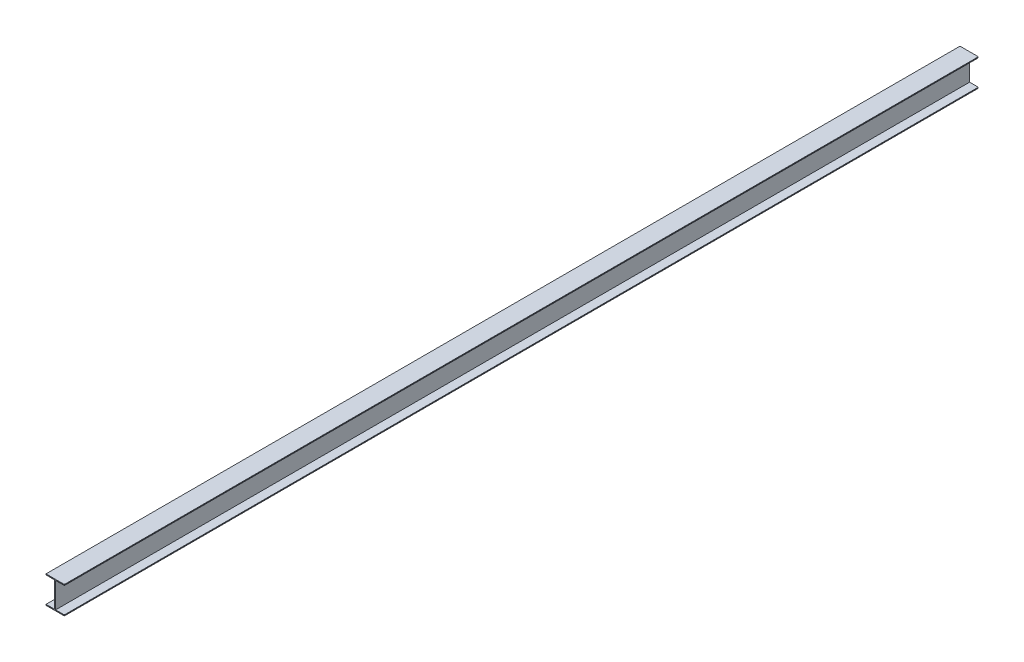
ISO-10303-21;
HEADER;
FILE_DESCRIPTION(('STEP AP214'),'2;1');
FILE_NAME('part.step','',(''),(''),'','','');
FILE_SCHEMA(('AUTOMOTIVE_DESIGN { 1 0 10303 214 1 1 1 1 }'));
ENDSEC;
DATA;
#1=APPLICATION_CONTEXT('core data for automotive mechanical design processes');
#2=APPLICATION_PROTOCOL_DEFINITION('international standard','automotive_design',2000,#1);
#3=PRODUCT_CONTEXT('',#1,'mechanical');
#4=PRODUCT('Part','Part','',(#3));
#5=PRODUCT_RELATED_PRODUCT_CATEGORY('part','',(#4));
#6=PRODUCT_DEFINITION_FORMATION('','',#4);
#7=PRODUCT_DEFINITION_CONTEXT('part definition',#1,'design');
#8=PRODUCT_DEFINITION('design','',#6,#7);
#9=PRODUCT_DEFINITION_SHAPE('','',#8);
#10=(LENGTH_UNIT() NAMED_UNIT(*) SI_UNIT(.MILLI.,.METRE.));
#11=(NAMED_UNIT(*) PLANE_ANGLE_UNIT() SI_UNIT($,.RADIAN.));
#12=(NAMED_UNIT(*) SI_UNIT($,.STERADIAN.) SOLID_ANGLE_UNIT());
#13=UNCERTAINTY_MEASURE_WITH_UNIT(LENGTH_MEASURE(1.E-05),#10,'distance_accuracy_value','');
#14=(GEOMETRIC_REPRESENTATION_CONTEXT(3) GLOBAL_UNCERTAINTY_ASSIGNED_CONTEXT((#13)) GLOBAL_UNIT_ASSIGNED_CONTEXT((#10,
#11,#12)) REPRESENTATION_CONTEXT('',''));
#15=CARTESIAN_POINT('',(0.,0.,0.));
#16=DIRECTION('',(0.,0.,1.));
#17=DIRECTION('',(1.,0.,0.));
#18=AXIS2_PLACEMENT_3D('',#15,#16,#17);
#19=CARTESIAN_POINT('',(101.6,-153.162240532958,5062.));
#20=DIRECTION('',(0.,1.,0.));
#21=DIRECTION('',(0.,0.,1.));
#22=AXIS2_PLACEMENT_3D('',#19,#20,#21);
#23=PLANE('',#22);
#24=DIRECTION('',(-1.,0.,0.));
#25=VECTOR('',#24,1.);
#26=CARTESIAN_POINT('',(101.6,-153.162240532958,2683.4));
#27=LINE('',#26,#25);
#28=CARTESIAN_POINT('',(98.425,-153.162240532958,2683.4));
#29=VERTEX_POINT('',#28);
#30=CARTESIAN_POINT('',(3.175,-153.162240532958,2683.4));
#31=VERTEX_POINT('',#30);
#32=EDGE_CURVE('E289',#29,#31,#27,.T.);
#33=ORIENTED_EDGE('',*,*,#32,.F.);
#34=DIRECTION('',(0.,0.,-1.));
#35=VECTOR('',#34,1.);
#36=CARTESIAN_POINT('',(98.425,-153.162240532958,5062.));
#37=LINE('',#36,#35);
#38=CARTESIAN_POINT('',(98.425,-153.162240532958,5058.825));
#39=VERTEX_POINT('',#38);
#40=EDGE_CURVE('E357',#29,#39,#37,.F.);
#41=ORIENTED_EDGE('',*,*,#40,.T.);
#42=DIRECTION('',(1.,0.,0.));
#43=VECTOR('',#42,1.);
#44=CARTESIAN_POINT('',(101.6,-153.162240532958,5058.825));
#45=LINE('',#44,#43);
#46=CARTESIAN_POINT('',(3.175,-153.162240532958,5058.825));
#47=VERTEX_POINT('',#46);
#48=EDGE_CURVE('E353',#39,#47,#45,.F.);
#49=ORIENTED_EDGE('',*,*,#48,.T.);
#50=DIRECTION('',(0.,0.,-1.));
#51=VECTOR('',#50,1.);
#52=CARTESIAN_POINT('',(3.175,-153.162240532958,5062.));
#53=LINE('',#52,#51);
#54=EDGE_CURVE('E355',#47,#31,#53,.T.);
#55=ORIENTED_EDGE('',*,*,#54,.T.);
#56=EDGE_LOOP('',(#33,#41,#49,#55));
#57=FACE_BOUND('',#56,.T.);
#58=ADVANCED_FACE('F40',(#57),#23,.F.);
#59=DIRECTION('',(1.,0.,0.));
#60=VECTOR('',#59,1.);
#61=CARTESIAN_POINT('',(101.6,-153.162240532958,2378.6));
#62=LINE('',#61,#60);
#63=CARTESIAN_POINT('',(3.175,-153.162240532958,2378.6));
#64=VERTEX_POINT('',#63);
#65=CARTESIAN_POINT('',(98.425,-153.162240532958,2378.6));
#66=VERTEX_POINT('',#65);
#67=EDGE_CURVE('E285',#64,#66,#62,.T.);
#68=ORIENTED_EDGE('',*,*,#67,.F.);
#69=DIRECTION('',(0.,0.,-1.));
#70=VECTOR('',#69,1.);
#71=CARTESIAN_POINT('',(3.175,-153.162240532958,5062.));
#72=LINE('',#71,#70);
#73=CARTESIAN_POINT('',(3.175,-153.162240532958,3.17499999999971));
#74=VERTEX_POINT('',#73);
#75=EDGE_CURVE('E325',#64,#74,#72,.T.);
#76=ORIENTED_EDGE('',*,*,#75,.T.);
#77=DIRECTION('',(1.,0.,0.));
#78=VECTOR('',#77,1.);
#79=CARTESIAN_POINT('',(98.425,-153.162240532958,3.17499999999971));
#80=LINE('',#79,#78);
#81=CARTESIAN_POINT('',(98.425,-153.162240532958,3.17499999999971));
#82=VERTEX_POINT('',#81);
#83=EDGE_CURVE('E323',#74,#82,#80,.T.);
#84=ORIENTED_EDGE('',*,*,#83,.T.);
#85=DIRECTION('',(0.,0.,-1.));
#86=VECTOR('',#85,1.);
#87=CARTESIAN_POINT('',(98.425,-153.162240532958,5062.));
#88=LINE('',#87,#86);
#89=EDGE_CURVE('E321',#82,#66,#88,.F.);
#90=ORIENTED_EDGE('',*,*,#89,.T.);
#91=EDGE_LOOP('',(#68,#76,#84,#90));
#92=FACE_BOUND('',#91,.T.);
#93=ADVANCED_FACE('F573',(#92),#23,.F.);
#94=CARTESIAN_POINT('',(0.,-7.11224053295814,5062.));
#95=DIRECTION('',(1.,0.,0.));
#96=DIRECTION('',(0.,0.,-1.));
#97=AXIS2_PLACEMENT_3D('',#94,#95,#96);
#98=PLANE('',#97);
#99=DIRECTION('',(0.,-1.,0.));
#100=VECTOR('',#99,1.);
#101=CARTESIAN_POINT('',(0.,-7.11224053295814,0.));
#102=LINE('',#101,#100);
#103=CARTESIAN_POINT('',(0.,-0.000240532958142959,0.));
#104=VERTEX_POINT('',#103);
#105=CARTESIAN_POINT('',(0.,-3.93724053295814,0.));
#106=VERTEX_POINT('',#105);
#107=EDGE_CURVE('E252',#104,#106,#102,.T.);
#108=ORIENTED_EDGE('',*,*,#107,.T.);
#109=DIRECTION('',(0.,0.,-1.));
#110=VECTOR('',#109,1.);
#111=CARTESIAN_POINT('',(0.,-3.93724053295814,5062.));
#112=LINE('',#111,#110);
#113=CARTESIAN_POINT('',(0.,-3.93724053295814,5062.));
#114=VERTEX_POINT('',#113);
#115=EDGE_CURVE('E419',#106,#114,#112,.F.);
#116=ORIENTED_EDGE('',*,*,#115,.T.);
#117=DIRECTION('',(0.,-1.,0.));
#118=VECTOR('',#117,1.);
#119=CARTESIAN_POINT('',(0.,-7.11224053295814,5062.));
#120=LINE('',#119,#118);
#121=CARTESIAN_POINT('',(0.,-0.000240532958142959,5062.));
#122=VERTEX_POINT('',#121);
#123=EDGE_CURVE('E226',#122,#114,#120,.T.);
#124=ORIENTED_EDGE('',*,*,#123,.F.);
#125=DIRECTION('',(0.,0.,-1.));
#126=VECTOR('',#125,1.);
#127=CARTESIAN_POINT('',(0.,-0.000240532958142959,5062.));
#128=LINE('',#127,#126);
#129=EDGE_CURVE('E251',#122,#104,#128,.T.);
#130=ORIENTED_EDGE('',*,*,#129,.T.);
#131=EDGE_LOOP('',(#108,#116,#124,#130));
#132=FACE_BOUND('',#131,.T.);
#133=ADVANCED_FACE('F461',(#132),#98,.F.);
#134=CARTESIAN_POINT('',(47.5660357142857,-7.11224053295814,5062.));
#135=DIRECTION('',(0.,1.,0.));
#136=DIRECTION('',(-1.,0.,0.));
#137=AXIS2_PLACEMENT_3D('',#134,#135,#136);
#138=PLANE('',#137);
#139=DIRECTION('',(0.,0.,-1.));
#140=VECTOR('',#139,1.);
#141=CARTESIAN_POINT('',(3.17499999999997,-7.11224053295814,5062.));
#142=LINE('',#141,#140);
#143=CARTESIAN_POINT('',(3.17499999999997,-7.11224053295814,5058.825));
#144=VERTEX_POINT('',#143);
#145=CARTESIAN_POINT('',(3.17499999999997,-7.11224053295814,3.17499999999971));
#146=VERTEX_POINT('',#145);
#147=EDGE_CURVE('E414',#144,#146,#142,.T.);
#148=ORIENTED_EDGE('',*,*,#147,.T.);
#149=DIRECTION('',(1.,0.,0.));
#150=VECTOR('',#149,1.);
#151=CARTESIAN_POINT('',(47.5660357142857,-7.11224053295814,3.17499999999971));
#152=LINE('',#151,#150);
#153=CARTESIAN_POINT('',(47.5660357142857,-7.11224053295814,3.17499999999971));
#154=VERTEX_POINT('',#153);
#155=EDGE_CURVE('E416',#146,#154,#152,.T.);
#156=ORIENTED_EDGE('',*,*,#155,.T.);
#157=DIRECTION('',(0.,0.,-1.));
#158=VECTOR('',#157,1.);
#159=CARTESIAN_POINT('',(47.5660357142857,-7.11224053295814,5062.));
#160=LINE('',#159,#158);
#161=CARTESIAN_POINT('',(47.5660357142857,-7.11224053295814,5058.825));
#162=VERTEX_POINT('',#161);
#163=EDGE_CURVE('E235',#162,#154,#160,.T.);
#164=ORIENTED_EDGE('',*,*,#163,.F.);
#165=DIRECTION('',(1.,0.,0.));
#166=VECTOR('',#165,1.);
#167=CARTESIAN_POINT('',(47.5660357142857,-7.11224053295814,5058.825));
#168=LINE('',#167,#166);
#169=EDGE_CURVE('E412',#162,#144,#168,.F.);
#170=ORIENTED_EDGE('',*,*,#169,.T.);
#171=EDGE_LOOP('',(#148,#156,#164,#170));
#172=FACE_BOUND('',#171,.T.);
#173=ADVANCED_FACE('F454',(#172),#138,.F.);
#174=CARTESIAN_POINT('',(47.5660357142857,-146.050240532958,5062.));
#175=DIRECTION('',(1.,0.,0.));
#176=DIRECTION('',(0.,0.,-1.));
#177=AXIS2_PLACEMENT_3D('',#174,#175,#176);
#178=PLANE('',#177);
#179=DIRECTION('',(0.,-1.,0.));
#180=VECTOR('',#179,1.);
#181=CARTESIAN_POINT('',(47.5660357142857,-146.050240532958,0.));
#182=LINE('',#181,#180);
#183=CARTESIAN_POINT('',(47.5660357142857,-3.93724053295814,0.));
#184=VERTEX_POINT('',#183);
#185=CARTESIAN_POINT('',(47.5660357142857,-146.050240532958,0.));
#186=VERTEX_POINT('',#185);
#187=EDGE_CURVE('E232',#184,#186,#182,.T.);
#188=ORIENTED_EDGE('',*,*,#187,.T.);
#189=DIRECTION('',(0.,0.,-1.));
#190=VECTOR('',#189,1.);
#191=CARTESIAN_POINT('',(47.5660357142857,-146.050240532958,5062.));
#192=LINE('',#191,#190);
#193=CARTESIAN_POINT('',(47.5660357142857,-146.050240532958,5062.));
#194=VERTEX_POINT('',#193);
#195=EDGE_CURVE('E229',#194,#186,#192,.T.);
#196=ORIENTED_EDGE('',*,*,#195,.F.);
#197=DIRECTION('',(0.,-1.,0.));
#198=VECTOR('',#197,1.);
#199=CARTESIAN_POINT('',(47.5660357142857,-146.050240532958,5062.));
#200=LINE('',#199,#198);
#201=CARTESIAN_POINT('',(47.5660357142857,-3.93724053295813,5062.));
#202=VERTEX_POINT('',#201);
#203=EDGE_CURVE('E64',#202,#194,#200,.T.);
#204=ORIENTED_EDGE('',*,*,#203,.F.);
#205=CARTESIAN_POINT('',(47.5660357142857,-3.93724053295814,5058.825));
#206=DIRECTION('',(1.,0.,0.));
#207=DIRECTION('',(0.,0.,-1.));
#208=AXIS2_PLACEMENT_3D('',#205,#206,#207);
#209=CIRCLE('',#208,3.175);
#210=EDGE_CURVE('E11',#202,#162,#209,.T.);
#211=ORIENTED_EDGE('',*,*,#210,.T.);
#212=ORIENTED_EDGE('',*,*,#163,.T.);
#213=CARTESIAN_POINT('',(47.5660357142857,-3.93724053295814,3.17499999999971));
#214=DIRECTION('',(1.,0.,0.));
#215=DIRECTION('',(0.,0.,-1.));
#216=AXIS2_PLACEMENT_3D('',#213,#214,#215);
#217=CIRCLE('',#216,3.175);
#218=EDGE_CURVE('E426',#154,#184,#217,.T.);
#219=ORIENTED_EDGE('',*,*,#218,.T.);
#220=EDGE_LOOP('',(#188,#196,#204,#211,#212,#219));
#221=FACE_BOUND('',#220,.T.);
#222=ADVANCED_FACE('F230',(#221),#178,.F.);
#223=CARTESIAN_POINT('',(0.,-146.050240532958,5062.));
#224=DIRECTION('',(0.,-1.,0.));
#225=DIRECTION('',(1.,0.,0.));
#226=AXIS2_PLACEMENT_3D('',#223,#224,#225);
#227=PLANE('',#226);
#228=DIRECTION('',(-1.,0.,0.));
#229=VECTOR('',#228,1.);
#230=CARTESIAN_POINT('',(0.,-146.050240532958,0.));
#231=LINE('',#230,#229);
#232=CARTESIAN_POINT('',(0.,-146.050240532958,0.));
#233=VERTEX_POINT('',#232);
#234=EDGE_CURVE('E257',#186,#233,#231,.T.);
#235=ORIENTED_EDGE('',*,*,#234,.T.);
#236=DIRECTION('',(0.,0.,-1.));
#237=VECTOR('',#236,1.);
#238=CARTESIAN_POINT('',(0.,-146.050240532958,5062.));
#239=LINE('',#238,#237);
#240=CARTESIAN_POINT('',(0.,-146.050240532958,5062.));
#241=VERTEX_POINT('',#240);
#242=EDGE_CURVE('E236',#241,#233,#239,.T.);
#243=ORIENTED_EDGE('',*,*,#242,.F.);
#244=DIRECTION('',(-1.,0.,0.));
#245=VECTOR('',#244,1.);
#246=CARTESIAN_POINT('',(0.,-146.050240532958,5062.));
#247=LINE('',#246,#245);
#248=EDGE_CURVE('E220',#194,#241,#247,.T.);
#249=ORIENTED_EDGE('',*,*,#248,.F.);
#250=ORIENTED_EDGE('',*,*,#195,.T.);
#251=EDGE_LOOP('',(#235,#243,#249,#250));
#252=FACE_BOUND('',#251,.T.);
#253=ADVANCED_FACE('F238',(#252),#227,.F.);
#254=CARTESIAN_POINT('',(0.,-153.162240532958,5062.));
#255=DIRECTION('',(1.,0.,0.));
#256=DIRECTION('',(0.,0.,-1.));
#257=AXIS2_PLACEMENT_3D('',#254,#255,#256);
#258=PLANE('',#257);
#259=DIRECTION('',(0.,-1.,0.));
#260=VECTOR('',#259,1.);
#261=CARTESIAN_POINT('',(0.,-153.162240532958,0.));
#262=LINE('',#261,#260);
#263=CARTESIAN_POINT('',(0.,-149.987240532958,0.));
#264=VERTEX_POINT('',#263);
#265=EDGE_CURVE('E259',#233,#264,#262,.T.);
#266=ORIENTED_EDGE('',*,*,#265,.T.);
#267=DIRECTION('',(0.,0.,-1.));
#268=VECTOR('',#267,1.);
#269=CARTESIAN_POINT('',(0.,-149.987240532958,5062.));
#270=LINE('',#269,#268);
#271=CARTESIAN_POINT('',(0.,-149.987240532958,2378.6));
#272=VERTEX_POINT('',#271);
#273=EDGE_CURVE('E332',#264,#272,#270,.F.);
#274=ORIENTED_EDGE('',*,*,#273,.T.);
#275=DIRECTION('',(0.,0.,-1.));
#276=VECTOR('',#275,1.);
#277=CARTESIAN_POINT('',(0.,-149.987240532958,5062.));
#278=LINE('',#277,#276);
#279=CARTESIAN_POINT('',(0.,-149.987240532958,2683.4));
#280=VERTEX_POINT('',#279);
#281=EDGE_CURVE('E330',#272,#280,#278,.F.);
#282=ORIENTED_EDGE('',*,*,#281,.T.);
#283=DIRECTION('',(0.,0.,-1.));
#284=VECTOR('',#283,1.);
#285=CARTESIAN_POINT('',(0.,-149.987240532958,5062.));
#286=LINE('',#285,#284);
#287=CARTESIAN_POINT('',(0.,-149.987240532958,5062.));
#288=VERTEX_POINT('',#287);
#289=EDGE_CURVE('E328',#280,#288,#286,.F.);
#290=ORIENTED_EDGE('',*,*,#289,.T.);
#291=DIRECTION('',(0.,-1.,0.));
#292=VECTOR('',#291,1.);
#293=CARTESIAN_POINT('',(0.,-153.162240532958,5062.));
#294=LINE('',#293,#292);
#295=EDGE_CURVE('E241',#241,#288,#294,.T.);
#296=ORIENTED_EDGE('',*,*,#295,.F.);
#297=ORIENTED_EDGE('',*,*,#242,.T.);
#298=EDGE_LOOP('',(#266,#274,#282,#290,#296,#297));
#299=FACE_BOUND('',#298,.T.);
#300=ADVANCED_FACE('F516',(#299),#258,.F.);
#301=ORIENTED_EDGE('',*,*,#32,.T.);
#302=DIRECTION('',(0.,0.,-1.));
#303=VECTOR('',#302,1.);
#304=CARTESIAN_POINT('',(3.175,-153.162240532958,5062.));
#305=LINE('',#304,#303);
#306=EDGE_CURVE('E339',#31,#64,#305,.T.);
#307=ORIENTED_EDGE('',*,*,#306,.T.);
#308=ORIENTED_EDGE('',*,*,#67,.T.);
#309=DIRECTION('',(0.,0.,-1.));
#310=VECTOR('',#309,1.);
#311=CARTESIAN_POINT('',(98.425,-153.162240532958,5062.));
#312=LINE('',#311,#310);
#313=CARTESIAN_POINT('',(98.425,-153.162240532958,2531.));
#314=VERTEX_POINT('',#313);
#315=EDGE_CURVE('E337',#66,#314,#312,.F.);
#316=ORIENTED_EDGE('',*,*,#315,.T.);
#317=DIRECTION('',(0.,0.,-1.));
#318=VECTOR('',#317,1.);
#319=CARTESIAN_POINT('',(98.425,-153.162240532958,5062.));
#320=LINE('',#319,#318);
#321=EDGE_CURVE('E335',#314,#29,#320,.F.);
#322=ORIENTED_EDGE('',*,*,#321,.T.);
#323=EDGE_LOOP('',(#301,#307,#308,#316,#322));
#324=FACE_BOUND('',#323,.T.);
#325=ADVANCED_FACE('F534',(#324),#23,.F.);
#326=CARTESIAN_POINT('',(101.6,-146.050240532958,5062.));
#327=DIRECTION('',(-1.,0.,0.));
#328=DIRECTION('',(0.,0.,1.));
#329=AXIS2_PLACEMENT_3D('',#326,#327,#328);
#330=PLANE('',#329);
#331=DIRECTION('',(0.,0.,-1.));
#332=VECTOR('',#331,1.);
#333=CARTESIAN_POINT('',(101.6,-149.987240532958,5062.));
#334=LINE('',#333,#332);
#335=CARTESIAN_POINT('',(101.6,-149.987240532958,2531.));
#336=VERTEX_POINT('',#335);
#337=CARTESIAN_POINT('',(101.6,-149.987240532958,2378.6));
#338=VERTEX_POINT('',#337);
#339=EDGE_CURVE('E349',#336,#338,#334,.T.);
#340=ORIENTED_EDGE('',*,*,#339,.T.);
#341=DIRECTION('',(0.,0.,-1.));
#342=VECTOR('',#341,1.);
#343=CARTESIAN_POINT('',(101.6,-149.987240532958,5062.));
#344=LINE('',#343,#342);
#345=CARTESIAN_POINT('',(101.6,-149.987240532958,3.17499999999971));
#346=VERTEX_POINT('',#345);
#347=EDGE_CURVE('E351',#338,#346,#344,.T.);
#348=ORIENTED_EDGE('',*,*,#347,.T.);
#349=DIRECTION('',(0.,1.,0.));
#350=VECTOR('',#349,1.);
#351=CARTESIAN_POINT('',(101.6,-146.050240532958,3.17499999999971));
#352=LINE('',#351,#350);
#353=CARTESIAN_POINT('',(101.6,-146.050240532958,3.17499999999971));
#354=VERTEX_POINT('',#353);
#355=EDGE_CURVE('E310',#346,#354,#352,.T.);
#356=ORIENTED_EDGE('',*,*,#355,.T.);
#357=DIRECTION('',(0.,0.,-1.));
#358=VECTOR('',#357,1.);
#359=CARTESIAN_POINT('',(101.6,-146.050240532958,5062.));
#360=LINE('',#359,#358);
#361=CARTESIAN_POINT('',(101.6,-146.050240532958,5058.825));
#362=VERTEX_POINT('',#361);
#363=EDGE_CURVE('E279',#362,#354,#360,.T.);
#364=ORIENTED_EDGE('',*,*,#363,.F.);
#365=DIRECTION('',(0.,1.,0.));
#366=VECTOR('',#365,1.);
#367=CARTESIAN_POINT('',(101.6,-146.050240532958,5058.825));
#368=LINE('',#367,#366);
#369=CARTESIAN_POINT('',(101.6,-149.987240532958,5058.825));
#370=VERTEX_POINT('',#369);
#371=EDGE_CURVE('E312',#362,#370,#368,.F.);
#372=ORIENTED_EDGE('',*,*,#371,.T.);
#373=DIRECTION('',(0.,0.,-1.));
#374=VECTOR('',#373,1.);
#375=CARTESIAN_POINT('',(101.6,-149.987240532958,5062.));
#376=LINE('',#375,#374);
#377=CARTESIAN_POINT('',(101.6,-149.987240532958,2683.4));
#378=VERTEX_POINT('',#377);
#379=EDGE_CURVE('E345',#370,#378,#376,.T.);
#380=ORIENTED_EDGE('',*,*,#379,.T.);
#381=DIRECTION('',(0.,0.,-1.));
#382=VECTOR('',#381,1.);
#383=CARTESIAN_POINT('',(101.6,-149.987240532958,5062.));
#384=LINE('',#383,#382);
#385=EDGE_CURVE('E347',#378,#336,#384,.T.);
#386=ORIENTED_EDGE('',*,*,#385,.T.);
#387=EDGE_LOOP('',(#340,#348,#356,#364,#372,#380,#386));
#388=FACE_BOUND('',#387,.T.);
#389=ADVANCED_FACE('F549',(#388),#330,.F.);
#390=CARTESIAN_POINT('',(53.4080357142857,-146.050240532958,5062.));
#391=DIRECTION('',(0.,-1.,0.));
#392=DIRECTION('',(1.,0.,0.));
#393=AXIS2_PLACEMENT_3D('',#390,#391,#392);
#394=PLANE('',#393);
#395=DIRECTION('',(-1.,0.,0.));
#396=VECTOR('',#395,1.);
#397=CARTESIAN_POINT('',(53.4080357142857,-146.050240532958,5062.));
#398=LINE('',#397,#396);
#399=CARTESIAN_POINT('',(98.425,-146.050240532958,5062.));
#400=VERTEX_POINT('',#399);
#401=CARTESIAN_POINT('',(53.4080357142857,-146.050240532958,5062.));
#402=VERTEX_POINT('',#401);
#403=EDGE_CURVE('E243',#400,#402,#398,.T.);
#404=ORIENTED_EDGE('',*,*,#403,.F.);
#405=CARTESIAN_POINT('',(98.425,-146.050240532958,5058.825));
#406=DIRECTION('',(0.,-1.,0.));
#407=DIRECTION('',(1.,0.,0.));
#408=AXIS2_PLACEMENT_3D('',#405,#406,#407);
#409=CIRCLE('',#408,3.175);
#410=EDGE_CURVE('E308',#400,#362,#409,.F.);
#411=ORIENTED_EDGE('',*,*,#410,.T.);
#412=ORIENTED_EDGE('',*,*,#363,.T.);
#413=CARTESIAN_POINT('',(98.425,-146.050240532958,3.17499999999971));
#414=DIRECTION('',(0.,-1.,0.));
#415=DIRECTION('',(1.,0.,0.));
#416=AXIS2_PLACEMENT_3D('',#413,#414,#415);
#417=CIRCLE('',#416,3.175);
#418=CARTESIAN_POINT('',(98.425,-146.050240532958,0.));
#419=VERTEX_POINT('',#418);
#420=EDGE_CURVE('E306',#354,#419,#417,.F.);
#421=ORIENTED_EDGE('',*,*,#420,.T.);
#422=DIRECTION('',(-1.,0.,0.));
#423=VECTOR('',#422,1.);
#424=CARTESIAN_POINT('',(53.4080357142857,-146.050240532958,0.));
#425=LINE('',#424,#423);
#426=CARTESIAN_POINT('',(53.4080357142857,-146.050240532958,0.));
#427=VERTEX_POINT('',#426);
#428=EDGE_CURVE('E262',#419,#427,#425,.T.);
#429=ORIENTED_EDGE('',*,*,#428,.T.);
#430=DIRECTION('',(0.,0.,-1.));
#431=VECTOR('',#430,1.);
#432=CARTESIAN_POINT('',(53.4080357142857,-146.050240532958,5062.));
#433=LINE('',#432,#431);
#434=EDGE_CURVE('E276',#402,#427,#433,.T.);
#435=ORIENTED_EDGE('',*,*,#434,.F.);
#436=EDGE_LOOP('',(#404,#411,#412,#421,#429,#435));
#437=FACE_BOUND('',#436,.T.);
#438=ADVANCED_FACE('F492',(#437),#394,.F.);
#439=CARTESIAN_POINT('',(53.4080357142857,-7.11224053295815,5062.));
#440=DIRECTION('',(-1.,0.,0.));
#441=DIRECTION('',(0.,-1.,0.));
#442=AXIS2_PLACEMENT_3D('',#439,#440,#441);
#443=PLANE('',#442);
#444=DIRECTION('',(0.,1.,0.));
#445=VECTOR('',#444,1.);
#446=CARTESIAN_POINT('',(53.4080357142857,-7.11224053295815,0.));
#447=LINE('',#446,#445);
#448=CARTESIAN_POINT('',(53.4080357142857,-3.93724053295815,0.));
#449=VERTEX_POINT('',#448);
#450=EDGE_CURVE('E264',#427,#449,#447,.T.);
#451=ORIENTED_EDGE('',*,*,#450,.T.);
#452=CARTESIAN_POINT('',(53.4080357142857,-3.93724053295815,3.17499999999971));
#453=DIRECTION('',(-1.,0.,0.));
#454=DIRECTION('',(0.,-1.,0.));
#455=AXIS2_PLACEMENT_3D('',#452,#453,#454);
#456=CIRCLE('',#455,3.175);
#457=CARTESIAN_POINT('',(53.4080357142857,-7.11224053295815,3.17499999999971));
#458=VERTEX_POINT('',#457);
#459=EDGE_CURVE('E424',#449,#458,#456,.T.);
#460=ORIENTED_EDGE('',*,*,#459,.T.);
#461=DIRECTION('',(0.,0.,-1.));
#462=VECTOR('',#461,1.);
#463=CARTESIAN_POINT('',(53.4080357142857,-7.11224053295815,5062.));
#464=LINE('',#463,#462);
#465=CARTESIAN_POINT('',(53.4080357142857,-7.11224053295815,5058.825));
#466=VERTEX_POINT('',#465);
#467=EDGE_CURVE('E273',#466,#458,#464,.T.);
#468=ORIENTED_EDGE('',*,*,#467,.F.);
#469=CARTESIAN_POINT('',(53.4080357142857,-3.93724053295815,5058.825));
#470=DIRECTION('',(-1.,0.,0.));
#471=DIRECTION('',(0.,-1.,0.));
#472=AXIS2_PLACEMENT_3D('',#469,#470,#471);
#473=CIRCLE('',#472,3.175);
#474=CARTESIAN_POINT('',(53.4080357142857,-3.93724053295815,5062.));
#475=VERTEX_POINT('',#474);
#476=EDGE_CURVE('E49',#466,#475,#473,.T.);
#477=ORIENTED_EDGE('',*,*,#476,.T.);
#478=DIRECTION('',(0.,1.,0.));
#479=VECTOR('',#478,1.);
#480=CARTESIAN_POINT('',(53.4080357142857,-7.11224053295815,5062.));
#481=LINE('',#480,#479);
#482=EDGE_CURVE('E57',#402,#475,#481,.T.);
#483=ORIENTED_EDGE('',*,*,#482,.F.);
#484=ORIENTED_EDGE('',*,*,#434,.T.);
#485=EDGE_LOOP('',(#451,#460,#468,#477,#483,#484));
#486=FACE_BOUND('',#485,.T.);
#487=ADVANCED_FACE('F487',(#486),#443,.F.);
#488=CARTESIAN_POINT('',(101.6,-7.11224053295814,5062.));
#489=DIRECTION('',(0.,1.,0.));
#490=DIRECTION('',(-1.,0.,0.));
#491=AXIS2_PLACEMENT_3D('',#488,#489,#490);
#492=PLANE('',#491);
#493=ORIENTED_EDGE('',*,*,#467,.T.);
#494=DIRECTION('',(1.,0.,0.));
#495=VECTOR('',#494,1.);
#496=CARTESIAN_POINT('',(98.425,-7.11224053295814,3.17499999999971));
#497=LINE('',#496,#495);
#498=CARTESIAN_POINT('',(98.425,-7.11224053295814,3.17499999999971));
#499=VERTEX_POINT('',#498);
#500=EDGE_CURVE('E398',#458,#499,#497,.T.);
#501=ORIENTED_EDGE('',*,*,#500,.T.);
#502=DIRECTION('',(0.,0.,-1.));
#503=VECTOR('',#502,1.);
#504=CARTESIAN_POINT('',(98.425,-7.11224053295814,5062.));
#505=LINE('',#504,#503);
#506=CARTESIAN_POINT('',(98.425,-7.11224053295814,5058.825));
#507=VERTEX_POINT('',#506);
#508=EDGE_CURVE('E396',#499,#507,#505,.F.);
#509=ORIENTED_EDGE('',*,*,#508,.T.);
#510=DIRECTION('',(1.,0.,0.));
#511=VECTOR('',#510,1.);
#512=CARTESIAN_POINT('',(101.6,-7.11224053295814,5058.825));
#513=LINE('',#512,#511);
#514=EDGE_CURVE('E363',#507,#466,#513,.F.);
#515=ORIENTED_EDGE('',*,*,#514,.T.);
#516=EDGE_LOOP('',(#493,#501,#509,#515));
#517=FACE_BOUND('',#516,.T.);
#518=ADVANCED_FACE('F618',(#517),#492,.F.);
#519=CARTESIAN_POINT('',(101.6,-0.000240532958130516,5062.));
#520=DIRECTION('',(-1.,0.,0.));
#521=DIRECTION('',(0.,0.,1.));
#522=AXIS2_PLACEMENT_3D('',#519,#520,#521);
#523=PLANE('',#522);
#524=DIRECTION('',(0.,1.,0.));
#525=VECTOR('',#524,1.);
#526=CARTESIAN_POINT('',(101.6,-0.000240532958130516,5058.825));
#527=LINE('',#526,#525);
#528=CARTESIAN_POINT('',(101.6,-0.000240532958130516,5058.825));
#529=VERTEX_POINT('',#528);
#530=CARTESIAN_POINT('',(101.6,-3.93724053295814,5058.825));
#531=VERTEX_POINT('',#530);
#532=EDGE_CURVE('E303',#529,#531,#527,.F.);
#533=ORIENTED_EDGE('',*,*,#532,.T.);
#534=DIRECTION('',(0.,0.,-1.));
#535=VECTOR('',#534,1.);
#536=CARTESIAN_POINT('',(101.6,-3.93724053295814,5062.));
#537=LINE('',#536,#535);
#538=CARTESIAN_POINT('',(101.6,-3.93724053295814,3.17499999999971));
#539=VERTEX_POINT('',#538);
#540=EDGE_CURVE('E408',#531,#539,#537,.T.);
#541=ORIENTED_EDGE('',*,*,#540,.T.);
#542=DIRECTION('',(0.,1.,0.));
#543=VECTOR('',#542,1.);
#544=CARTESIAN_POINT('',(101.6,-0.000240532958130516,3.17499999999971));
#545=LINE('',#544,#543);
#546=CARTESIAN_POINT('',(101.6,-0.000240532958130516,3.17499999999971));
#547=VERTEX_POINT('',#546);
#548=EDGE_CURVE('E301',#539,#547,#545,.T.);
#549=ORIENTED_EDGE('',*,*,#548,.T.);
#550=DIRECTION('',(0.,0.,-1.));
#551=VECTOR('',#550,1.);
#552=CARTESIAN_POINT('',(101.6,-0.000240532958130516,5062.));
#553=LINE('',#552,#551);
#554=EDGE_CURVE('E270',#529,#547,#553,.T.);
#555=ORIENTED_EDGE('',*,*,#554,.F.);
#556=EDGE_LOOP('',(#533,#541,#549,#555));
#557=FACE_BOUND('',#556,.T.);
#558=ADVANCED_FACE('F626',(#557),#523,.F.);
#559=CARTESIAN_POINT('',(0.,-0.000240532958142959,5062.));
#560=DIRECTION('',(0.,-1.,0.));
#561=DIRECTION('',(1.,0.,0.));
#562=AXIS2_PLACEMENT_3D('',#559,#560,#561);
#563=PLANE('',#562);
#564=DIRECTION('',(-1.,0.,0.));
#565=VECTOR('',#564,1.);
#566=CARTESIAN_POINT('',(0.,-0.000240532958142959,5062.));
#567=LINE('',#566,#565);
#568=CARTESIAN_POINT('',(98.425,-0.000240532958130905,5062.));
#569=VERTEX_POINT('',#568);
#570=EDGE_CURVE('E249',#569,#122,#567,.T.);
#571=ORIENTED_EDGE('',*,*,#570,.F.);
#572=CARTESIAN_POINT('',(98.425,-0.000240532958130905,5058.825));
#573=DIRECTION('',(0.,-1.,0.));
#574=DIRECTION('',(1.,0.,0.));
#575=AXIS2_PLACEMENT_3D('',#572,#573,#574);
#576=CIRCLE('',#575,3.175);
#577=EDGE_CURVE('E299',#569,#529,#576,.F.);
#578=ORIENTED_EDGE('',*,*,#577,.T.);
#579=ORIENTED_EDGE('',*,*,#554,.T.);
#580=CARTESIAN_POINT('',(98.425,-0.000240532958130905,3.17499999999971));
#581=DIRECTION('',(0.,-1.,0.));
#582=DIRECTION('',(1.,0.,0.));
#583=AXIS2_PLACEMENT_3D('',#580,#581,#582);
#584=CIRCLE('',#583,3.175);
#585=CARTESIAN_POINT('',(98.425,-0.000240532958130905,0.));
#586=VERTEX_POINT('',#585);
#587=EDGE_CURVE('E297',#547,#586,#584,.F.);
#588=ORIENTED_EDGE('',*,*,#587,.T.);
#589=DIRECTION('',(-1.,0.,0.));
#590=VECTOR('',#589,1.);
#591=CARTESIAN_POINT('',(0.,-0.000240532958142959,0.));
#592=LINE('',#591,#590);
#593=EDGE_CURVE('E266',#586,#104,#592,.T.);
#594=ORIENTED_EDGE('',*,*,#593,.T.);
#595=ORIENTED_EDGE('',*,*,#129,.F.);
#596=EDGE_LOOP('',(#571,#578,#579,#588,#594,#595));
#597=FACE_BOUND('',#596,.T.);
#598=ADVANCED_FACE('F466',(#597),#563,.F.);
#599=CARTESIAN_POINT('',(0.,0.,5062.));
#600=DIRECTION('',(0.,0.,-1.));
#601=DIRECTION('',(-1.,0.,0.));
#602=AXIS2_PLACEMENT_3D('',#599,#600,#601);
#603=PLANE('',#602);
#604=ORIENTED_EDGE('',*,*,#482,.T.);
#605=DIRECTION('',(1.,0.,0.));
#606=VECTOR('',#605,1.);
#607=CARTESIAN_POINT('',(0.,-3.93724053295816,5062.));
#608=LINE('',#607,#606);
#609=CARTESIAN_POINT('',(98.425,-3.93724053295814,5062.));
#610=VERTEX_POINT('',#609);
#611=EDGE_CURVE('E422',#475,#610,#608,.T.);
#612=ORIENTED_EDGE('',*,*,#611,.T.);
#613=DIRECTION('',(0.,1.,0.));
#614=VECTOR('',#613,1.);
#615=CARTESIAN_POINT('',(98.425,0.,5062.));
#616=LINE('',#615,#614);
#617=EDGE_CURVE('E295',#610,#569,#616,.T.);
#618=ORIENTED_EDGE('',*,*,#617,.T.);
#619=ORIENTED_EDGE('',*,*,#570,.T.);
#620=ORIENTED_EDGE('',*,*,#123,.T.);
#621=DIRECTION('',(1.,0.,0.));
#622=VECTOR('',#621,1.);
#623=CARTESIAN_POINT('',(0.,-3.93724053295814,5062.));
#624=LINE('',#623,#622);
#625=EDGE_CURVE('E224',#114,#202,#624,.T.);
#626=ORIENTED_EDGE('',*,*,#625,.T.);
#627=ORIENTED_EDGE('',*,*,#203,.T.);
#628=ORIENTED_EDGE('',*,*,#248,.T.);
#629=ORIENTED_EDGE('',*,*,#295,.T.);
#630=DIRECTION('',(1.,0.,0.));
#631=VECTOR('',#630,1.);
#632=CARTESIAN_POINT('',(0.,-149.987240532958,5062.));
#633=LINE('',#632,#631);
#634=CARTESIAN_POINT('',(98.425,-149.987240532958,5062.));
#635=VERTEX_POINT('',#634);
#636=EDGE_CURVE('E361',#288,#635,#633,.T.);
#637=ORIENTED_EDGE('',*,*,#636,.T.);
#638=DIRECTION('',(0.,1.,0.));
#639=VECTOR('',#638,1.);
#640=CARTESIAN_POINT('',(98.425,0.,5062.));
#641=LINE('',#640,#639);
#642=EDGE_CURVE('E293',#635,#400,#641,.T.);
#643=ORIENTED_EDGE('',*,*,#642,.T.);
#644=ORIENTED_EDGE('',*,*,#403,.T.);
#645=EDGE_LOOP('',(#604,#612,#618,#619,#620,#626,#627,#628,#629,#637,#643,#644));
#646=FACE_BOUND('',#645,.T.);
#647=ADVANCED_FACE('F217',(#646),#603,.F.);
#648=CARTESIAN_POINT('',(0.,0.,0.));
#649=DIRECTION('',(0.,0.,-1.));
#650=DIRECTION('',(-1.,0.,0.));
#651=AXIS2_PLACEMENT_3D('',#648,#649,#650);
#652=PLANE('',#651);
#653=DIRECTION('',(0.,1.,0.));
#654=VECTOR('',#653,1.);
#655=CARTESIAN_POINT('',(98.425,-7.11224053295814,0.));
#656=LINE('',#655,#654);
#657=CARTESIAN_POINT('',(98.425,-3.93724053295814,0.));
#658=VERTEX_POINT('',#657);
#659=EDGE_CURVE('E315',#586,#658,#656,.F.);
#660=ORIENTED_EDGE('',*,*,#659,.T.);
#661=DIRECTION('',(1.,0.,0.));
#662=VECTOR('',#661,1.);
#663=CARTESIAN_POINT('',(53.4080357142857,-3.93724053295815,0.));
#664=LINE('',#663,#662);
#665=EDGE_CURVE('E403',#658,#449,#664,.F.);
#666=ORIENTED_EDGE('',*,*,#665,.T.);
#667=ORIENTED_EDGE('',*,*,#450,.F.);
#668=ORIENTED_EDGE('',*,*,#428,.F.);
#669=DIRECTION('',(0.,1.,0.));
#670=VECTOR('',#669,1.);
#671=CARTESIAN_POINT('',(98.425,-153.162240532958,0.));
#672=LINE('',#671,#670);
#673=CARTESIAN_POINT('',(98.425,-149.987240532958,0.));
#674=VERTEX_POINT('',#673);
#675=EDGE_CURVE('E318',#419,#674,#672,.F.);
#676=ORIENTED_EDGE('',*,*,#675,.T.);
#677=DIRECTION('',(1.,0.,0.));
#678=VECTOR('',#677,1.);
#679=CARTESIAN_POINT('',(0.,-149.987240532958,0.));
#680=LINE('',#679,#678);
#681=EDGE_CURVE('E341',#674,#264,#680,.F.);
#682=ORIENTED_EDGE('',*,*,#681,.T.);
#683=ORIENTED_EDGE('',*,*,#265,.F.);
#684=ORIENTED_EDGE('',*,*,#234,.F.);
#685=ORIENTED_EDGE('',*,*,#187,.F.);
#686=DIRECTION('',(1.,0.,0.));
#687=VECTOR('',#686,1.);
#688=CARTESIAN_POINT('',(0.,-3.93724053295814,0.));
#689=LINE('',#688,#687);
#690=EDGE_CURVE('E401',#184,#106,#689,.F.);
#691=ORIENTED_EDGE('',*,*,#690,.T.);
#692=ORIENTED_EDGE('',*,*,#107,.F.);
#693=ORIENTED_EDGE('',*,*,#593,.F.);
#694=EDGE_LOOP('',(#660,#666,#667,#668,#676,#682,#683,#684,#685,#691,#692,#693));
#695=FACE_BOUND('',#694,.T.);
#696=ADVANCED_FACE('F458',(#695),#652,.T.);
#697=CARTESIAN_POINT('',(98.425,0.,5058.825));
#698=DIRECTION('',(0.,1.,0.));
#699=DIRECTION('',(0.,0.,1.));
#700=AXIS2_PLACEMENT_3D('',#697,#698,#699);
#701=CYLINDRICAL_SURFACE('',#700,3.175);
#702=ORIENTED_EDGE('',*,*,#617,.F.);
#703=CARTESIAN_POINT('',(98.425,-3.93724053295814,5058.825));
#704=DIRECTION('',(0.,1.,0.));
#705=DIRECTION('',(0.,0.,1.));
#706=AXIS2_PLACEMENT_3D('',#703,#704,#705);
#707=CIRCLE('',#706,3.175);
#708=EDGE_CURVE('E410',#610,#531,#707,.T.);
#709=ORIENTED_EDGE('',*,*,#708,.T.);
#710=ORIENTED_EDGE('',*,*,#532,.F.);
#711=ORIENTED_EDGE('',*,*,#577,.F.);
#712=EDGE_LOOP('',(#702,#709,#710,#711));
#713=FACE_BOUND('',#712,.T.);
#714=ADVANCED_FACE('F562',(#713),#701,.T.);
#715=CARTESIAN_POINT('',(98.425,0.,5058.825));
#716=DIRECTION('',(0.,1.,0.));
#717=DIRECTION('',(0.,0.,1.));
#718=AXIS2_PLACEMENT_3D('',#715,#716,#717);
#719=CYLINDRICAL_SURFACE('',#718,3.175);
#720=ORIENTED_EDGE('',*,*,#642,.F.);
#721=CARTESIAN_POINT('',(98.425,-149.987240532958,5058.825));
#722=DIRECTION('',(0.,1.,0.));
#723=DIRECTION('',(0.,0.,1.));
#724=AXIS2_PLACEMENT_3D('',#721,#722,#723);
#725=CIRCLE('',#724,3.175);
#726=EDGE_CURVE('E359',#635,#370,#725,.T.);
#727=ORIENTED_EDGE('',*,*,#726,.T.);
#728=ORIENTED_EDGE('',*,*,#371,.F.);
#729=ORIENTED_EDGE('',*,*,#410,.F.);
#730=EDGE_LOOP('',(#720,#727,#728,#729));
#731=FACE_BOUND('',#730,.T.);
#732=ADVANCED_FACE('F559',(#731),#719,.T.);
#733=CARTESIAN_POINT('',(98.425,-146.050240532958,3.17499999999971));
#734=DIRECTION('',(0.,-1.,0.));
#735=DIRECTION('',(0.,0.,-1.));
#736=AXIS2_PLACEMENT_3D('',#733,#734,#735);
#737=CYLINDRICAL_SURFACE('',#736,3.175);
#738=ORIENTED_EDGE('',*,*,#355,.F.);
#739=CARTESIAN_POINT('',(98.425,-149.987240532958,3.17499999999971));
#740=DIRECTION('',(0.,-1.,0.));
#741=DIRECTION('',(0.,0.,-1.));
#742=AXIS2_PLACEMENT_3D('',#739,#740,#741);
#743=CIRCLE('',#742,3.175);
#744=EDGE_CURVE('E343',#346,#674,#743,.F.);
#745=ORIENTED_EDGE('',*,*,#744,.T.);
#746=ORIENTED_EDGE('',*,*,#675,.F.);
#747=ORIENTED_EDGE('',*,*,#420,.F.);
#748=EDGE_LOOP('',(#738,#745,#746,#747));
#749=FACE_BOUND('',#748,.T.);
#750=ADVANCED_FACE('F497',(#749),#737,.T.);
#751=CARTESIAN_POINT('',(98.425,-0.000240532958130516,3.17499999999971));
#752=DIRECTION('',(0.,-1.,0.));
#753=DIRECTION('',(0.,0.,-1.));
#754=AXIS2_PLACEMENT_3D('',#751,#752,#753);
#755=CYLINDRICAL_SURFACE('',#754,3.175);
#756=ORIENTED_EDGE('',*,*,#548,.F.);
#757=CARTESIAN_POINT('',(98.425,-3.93724053295814,3.17499999999971));
#758=DIRECTION('',(0.,-1.,0.));
#759=DIRECTION('',(0.,0.,-1.));
#760=AXIS2_PLACEMENT_3D('',#757,#758,#759);
#761=CIRCLE('',#760,3.175);
#762=EDGE_CURVE('E406',#539,#658,#761,.F.);
#763=ORIENTED_EDGE('',*,*,#762,.T.);
#764=ORIENTED_EDGE('',*,*,#659,.F.);
#765=ORIENTED_EDGE('',*,*,#587,.F.);
#766=EDGE_LOOP('',(#756,#763,#764,#765));
#767=FACE_BOUND('',#766,.T.);
#768=ADVANCED_FACE('F472',(#767),#755,.T.);
#769=CARTESIAN_POINT('',(98.425,-149.987240532958,5062.));
#770=DIRECTION('',(0.,0.,-1.));
#771=DIRECTION('',(-1.,0.,0.));
#772=AXIS2_PLACEMENT_3D('',#769,#770,#771);
#773=CYLINDRICAL_SURFACE('',#772,3.175);
#774=CARTESIAN_POINT('',(98.425,-149.987240532958,5058.825));
#775=DIRECTION('',(0.,0.,1.));
#776=DIRECTION('',(1.,0.,0.));
#777=AXIS2_PLACEMENT_3D('',#774,#775,#776);
#778=CIRCLE('',#777,3.175);
#779=EDGE_CURVE('E390',#39,#370,#778,.T.);
#780=ORIENTED_EDGE('',*,*,#779,.F.);
#781=ORIENTED_EDGE('',*,*,#40,.F.);
#782=CARTESIAN_POINT('',(98.425,-149.987240532958,2683.4));
#783=DIRECTION('',(0.,0.,-1.));
#784=DIRECTION('',(-1.,0.,0.));
#785=AXIS2_PLACEMENT_3D('',#782,#783,#784);
#786=CIRCLE('',#785,3.175);
#787=EDGE_CURVE('E255',#378,#29,#786,.T.);
#788=ORIENTED_EDGE('',*,*,#787,.F.);
#789=ORIENTED_EDGE('',*,*,#379,.F.);
#790=EDGE_LOOP('',(#780,#781,#788,#789));
#791=FACE_BOUND('',#790,.T.);
#792=ADVANCED_FACE('F554',(#791),#773,.T.);
#793=CARTESIAN_POINT('',(98.425,-149.987240532958,5062.));
#794=DIRECTION('',(0.,0.,-1.));
#795=DIRECTION('',(-1.,0.,0.));
#796=AXIS2_PLACEMENT_3D('',#793,#794,#795);
#797=CYLINDRICAL_SURFACE('',#796,3.175);
#798=ORIENTED_EDGE('',*,*,#787,.T.);
#799=ORIENTED_EDGE('',*,*,#321,.F.);
#800=CARTESIAN_POINT('',(98.425,-149.987240532958,2531.));
#801=DIRECTION('',(0.,0.,-1.));
#802=DIRECTION('',(-1.,0.,0.));
#803=AXIS2_PLACEMENT_3D('',#800,#801,#802);
#804=CIRCLE('',#803,3.175);
#805=EDGE_CURVE('E387',#336,#314,#804,.T.);
#806=ORIENTED_EDGE('',*,*,#805,.F.);
#807=ORIENTED_EDGE('',*,*,#385,.F.);
#808=EDGE_LOOP('',(#798,#799,#806,#807));
#809=FACE_BOUND('',#808,.T.);
#810=ADVANCED_FACE('F540',(#809),#797,.T.);
#811=CARTESIAN_POINT('',(98.425,-149.987240532958,5058.825));
#812=DIRECTION('',(0.,1.,0.));
#813=DIRECTION('',(0.,0.,1.));
#814=AXIS2_PLACEMENT_3D('',#811,#812,#813);
#815=SPHERICAL_SURFACE('',#814,3.175);
#816=ORIENTED_EDGE('',*,*,#779,.T.);
#817=ORIENTED_EDGE('',*,*,#726,.F.);
#818=CARTESIAN_POINT('',(98.425,-149.987240532958,5058.825));
#819=DIRECTION('',(-1.,0.,0.));
#820=DIRECTION('',(0.,0.,1.));
#821=AXIS2_PLACEMENT_3D('',#818,#819,#820);
#822=CIRCLE('',#821,3.175);
#823=EDGE_CURVE('E384',#39,#635,#822,.T.);
#824=ORIENTED_EDGE('',*,*,#823,.F.);
#825=EDGE_LOOP('',(#816,#817,#824));
#826=FACE_BOUND('',#825,.T.);
#827=ADVANCED_FACE('F557',(#826),#815,.T.);
#828=CARTESIAN_POINT('',(98.425,-149.987240532958,5062.));
#829=DIRECTION('',(0.,0.,-1.));
#830=DIRECTION('',(-1.,0.,0.));
#831=AXIS2_PLACEMENT_3D('',#828,#829,#830);
#832=CYLINDRICAL_SURFACE('',#831,3.175);
#833=ORIENTED_EDGE('',*,*,#805,.T.);
#834=ORIENTED_EDGE('',*,*,#315,.F.);
#835=CARTESIAN_POINT('',(98.425,-149.987240532958,2378.6));
#836=DIRECTION('',(0.,0.,-1.));
#837=DIRECTION('',(-1.,0.,0.));
#838=AXIS2_PLACEMENT_3D('',#835,#836,#837);
#839=CIRCLE('',#838,3.175);
#840=EDGE_CURVE('E381',#338,#66,#839,.T.);
#841=ORIENTED_EDGE('',*,*,#840,.F.);
#842=ORIENTED_EDGE('',*,*,#339,.F.);
#843=EDGE_LOOP('',(#833,#834,#841,#842));
#844=FACE_BOUND('',#843,.T.);
#845=ADVANCED_FACE('F545',(#844),#832,.T.);
#846=CARTESIAN_POINT('',(0.,-149.987240532958,5058.825));
#847=DIRECTION('',(1.,0.,0.));
#848=DIRECTION('',(0.,0.,-1.));
#849=AXIS2_PLACEMENT_3D('',#846,#847,#848);
#850=CYLINDRICAL_SURFACE('',#849,3.175);
#851=ORIENTED_EDGE('',*,*,#823,.T.);
#852=ORIENTED_EDGE('',*,*,#636,.F.);
#853=CARTESIAN_POINT('',(3.175,-149.987240532958,5058.825));
#854=DIRECTION('',(0.707106781186547,0.,0.707106781186547));
#855=DIRECTION('',(0.707106781186547,0.,-0.707106781186547));
#856=AXIS2_PLACEMENT_3D('',#853,#854,#855);
#857=ELLIPSE('',#856,4.49012806053458,3.175);
#858=EDGE_CURVE('E378',#47,#288,#857,.F.);
#859=ORIENTED_EDGE('',*,*,#858,.F.);
#860=ORIENTED_EDGE('',*,*,#48,.F.);
#861=EDGE_LOOP('',(#851,#852,#859,#860));
#862=FACE_BOUND('',#861,.T.);
#863=ADVANCED_FACE('F522',(#862),#850,.T.);
#864=CARTESIAN_POINT('',(98.425,-149.987240532958,5062.));
#865=DIRECTION('',(0.,0.,-1.));
#866=DIRECTION('',(-1.,0.,0.));
#867=AXIS2_PLACEMENT_3D('',#864,#865,#866);
#868=CYLINDRICAL_SURFACE('',#867,3.175);
#869=ORIENTED_EDGE('',*,*,#840,.T.);
#870=ORIENTED_EDGE('',*,*,#89,.F.);
#871=CARTESIAN_POINT('',(98.425,-149.987240532958,3.17499999999971));
#872=DIRECTION('',(0.,0.,-1.));
#873=DIRECTION('',(-1.,0.,0.));
#874=AXIS2_PLACEMENT_3D('',#871,#872,#873);
#875=CIRCLE('',#874,3.175);
#876=EDGE_CURVE('E375',#346,#82,#875,.T.);
#877=ORIENTED_EDGE('',*,*,#876,.F.);
#878=ORIENTED_EDGE('',*,*,#347,.F.);
#879=EDGE_LOOP('',(#869,#870,#877,#878));
#880=FACE_BOUND('',#879,.T.);
#881=ADVANCED_FACE('F742',(#880),#868,.T.);
#882=CARTESIAN_POINT('',(3.175,-149.987240532958,5062.));
#883=DIRECTION('',(0.,0.,-1.));
#884=DIRECTION('',(-1.,0.,0.));
#885=AXIS2_PLACEMENT_3D('',#882,#883,#884);
#886=CYLINDRICAL_SURFACE('',#885,3.175);
#887=ORIENTED_EDGE('',*,*,#858,.T.);
#888=ORIENTED_EDGE('',*,*,#289,.F.);
#889=CARTESIAN_POINT('',(3.175,-149.987240532958,2683.4));
#890=DIRECTION('',(0.,0.,-1.));
#891=DIRECTION('',(-1.,0.,0.));
#892=AXIS2_PLACEMENT_3D('',#889,#890,#891);
#893=CIRCLE('',#892,3.175);
#894=EDGE_CURVE('E372',#31,#280,#893,.T.);
#895=ORIENTED_EDGE('',*,*,#894,.F.);
#896=ORIENTED_EDGE('',*,*,#54,.F.);
#897=EDGE_LOOP('',(#887,#888,#895,#896));
#898=FACE_BOUND('',#897,.T.);
#899=ADVANCED_FACE('F527',(#898),#886,.T.);
#900=CARTESIAN_POINT('',(98.425,-149.987240532958,3.17499999999971));
#901=DIRECTION('',(0.,1.,0.));
#902=DIRECTION('',(0.,0.,1.));
#903=AXIS2_PLACEMENT_3D('',#900,#901,#902);
#904=SPHERICAL_SURFACE('',#903,3.175);
#905=ORIENTED_EDGE('',*,*,#744,.F.);
#906=ORIENTED_EDGE('',*,*,#876,.T.);
#907=CARTESIAN_POINT('',(98.425,-149.987240532958,3.17499999999971));
#908=DIRECTION('',(-1.,0.,0.));
#909=DIRECTION('',(0.,0.,1.));
#910=AXIS2_PLACEMENT_3D('',#907,#908,#909);
#911=CIRCLE('',#910,3.175);
#912=EDGE_CURVE('E369',#674,#82,#911,.T.);
#913=ORIENTED_EDGE('',*,*,#912,.F.);
#914=EDGE_LOOP('',(#905,#906,#913));
#915=FACE_BOUND('',#914,.T.);
#916=ADVANCED_FACE('F504',(#915),#904,.T.);
#917=CARTESIAN_POINT('',(3.175,-149.987240532958,5062.));
#918=DIRECTION('',(0.,0.,-1.));
#919=DIRECTION('',(-1.,0.,0.));
#920=AXIS2_PLACEMENT_3D('',#917,#918,#919);
#921=CYLINDRICAL_SURFACE('',#920,3.175);
#922=ORIENTED_EDGE('',*,*,#894,.T.);
#923=ORIENTED_EDGE('',*,*,#281,.F.);
#924=CARTESIAN_POINT('',(3.175,-149.987240532958,2378.6));
#925=DIRECTION('',(0.,0.,-1.));
#926=DIRECTION('',(-1.,0.,0.));
#927=AXIS2_PLACEMENT_3D('',#924,#925,#926);
#928=CIRCLE('',#927,3.175);
#929=EDGE_CURVE('E366',#64,#272,#928,.T.);
#930=ORIENTED_EDGE('',*,*,#929,.F.);
#931=ORIENTED_EDGE('',*,*,#306,.F.);
#932=EDGE_LOOP('',(#922,#923,#930,#931));
#933=FACE_BOUND('',#932,.T.);
#934=ADVANCED_FACE('F750',(#933),#921,.T.);
#935=CARTESIAN_POINT('',(101.6,-149.987240532958,3.17499999999971));
#936=DIRECTION('',(-1.,0.,0.));
#937=DIRECTION('',(0.,0.,1.));
#938=AXIS2_PLACEMENT_3D('',#935,#936,#937);
#939=CYLINDRICAL_SURFACE('',#938,3.175);
#940=ORIENTED_EDGE('',*,*,#912,.T.);
#941=ORIENTED_EDGE('',*,*,#83,.F.);
#942=CARTESIAN_POINT('',(3.175,-149.987240532958,3.17499999999971));
#943=DIRECTION('',(-0.707106781186547,0.,0.707106781186547));
#944=DIRECTION('',(-0.707106781186547,0.,-0.707106781186547));
#945=AXIS2_PLACEMENT_3D('',#942,#943,#944);
#946=ELLIPSE('',#945,4.49012806053458,3.175);
#947=EDGE_CURVE('E364',#264,#74,#946,.T.);
#948=ORIENTED_EDGE('',*,*,#947,.F.);
#949=ORIENTED_EDGE('',*,*,#681,.F.);
#950=EDGE_LOOP('',(#940,#941,#948,#949));
#951=FACE_BOUND('',#950,.T.);
#952=ADVANCED_FACE('F508',(#951),#939,.T.);
#953=CARTESIAN_POINT('',(3.175,-149.987240532958,5062.));
#954=DIRECTION('',(0.,0.,-1.));
#955=DIRECTION('',(-1.,0.,0.));
#956=AXIS2_PLACEMENT_3D('',#953,#954,#955);
#957=CYLINDRICAL_SURFACE('',#956,3.175);
#958=ORIENTED_EDGE('',*,*,#929,.T.);
#959=ORIENTED_EDGE('',*,*,#273,.F.);
#960=ORIENTED_EDGE('',*,*,#947,.T.);
#961=ORIENTED_EDGE('',*,*,#75,.F.);
#962=EDGE_LOOP('',(#958,#959,#960,#961));
#963=FACE_BOUND('',#962,.T.);
#964=ADVANCED_FACE('F512',(#963),#957,.T.);
#965=CARTESIAN_POINT('',(0.,-3.93724053295816,5058.825));
#966=DIRECTION('',(1.,0.,0.));
#967=DIRECTION('',(0.,1.,0.));
#968=AXIS2_PLACEMENT_3D('',#965,#966,#967);
#969=CYLINDRICAL_SURFACE('',#968,3.175);
#970=CARTESIAN_POINT('',(98.425,-3.93724053295814,5058.825));
#971=DIRECTION('',(1.,0.,0.));
#972=DIRECTION('',(0.,0.,-1.));
#973=AXIS2_PLACEMENT_3D('',#970,#971,#972);
#974=CIRCLE('',#973,3.175);
#975=EDGE_CURVE('E367',#610,#507,#974,.T.);
#976=ORIENTED_EDGE('',*,*,#975,.F.);
#977=ORIENTED_EDGE('',*,*,#611,.F.);
#978=ORIENTED_EDGE('',*,*,#476,.F.);
#979=ORIENTED_EDGE('',*,*,#514,.F.);
#980=EDGE_LOOP('',(#976,#977,#978,#979));
#981=FACE_BOUND('',#980,.T.);
#982=ADVANCED_FACE('F663',(#981),#969,.T.);
#983=CARTESIAN_POINT('',(98.425,-3.93724053295814,5058.825));
#984=DIRECTION('',(0.,1.,0.));
#985=DIRECTION('',(-1.,0.,0.));
#986=AXIS2_PLACEMENT_3D('',#983,#984,#985);
#987=SPHERICAL_SURFACE('',#986,3.175);
#988=ORIENTED_EDGE('',*,*,#708,.F.);
#989=ORIENTED_EDGE('',*,*,#975,.T.);
#990=CARTESIAN_POINT('',(98.425,-3.93724053295814,5058.825));
#991=DIRECTION('',(0.,0.,-1.));
#992=DIRECTION('',(-1.,0.,0.));
#993=AXIS2_PLACEMENT_3D('',#990,#991,#992);
#994=CIRCLE('',#993,3.175);
#995=EDGE_CURVE('E434',#531,#507,#994,.T.);
#996=ORIENTED_EDGE('',*,*,#995,.F.);
#997=EDGE_LOOP('',(#988,#989,#996));
#998=FACE_BOUND('',#997,.T.);
#999=ADVANCED_FACE('F668',(#998),#987,.T.);
#1000=CARTESIAN_POINT('',(98.425,-3.93724053295814,5062.));
#1001=DIRECTION('',(0.,0.,-1.));
#1002=DIRECTION('',(-1.,0.,0.));
#1003=AXIS2_PLACEMENT_3D('',#1000,#1001,#1002);
#1004=CYLINDRICAL_SURFACE('',#1003,3.175);
#1005=CARTESIAN_POINT('',(98.425,-3.93724053295814,3.17499999999971));
#1006=DIRECTION('',(0.,0.,-1.));
#1007=DIRECTION('',(-1.,0.,0.));
#1008=AXIS2_PLACEMENT_3D('',#1005,#1006,#1007);
#1009=CIRCLE('',#1008,3.175);
#1010=EDGE_CURVE('E431',#539,#499,#1009,.T.);
#1011=ORIENTED_EDGE('',*,*,#1010,.F.);
#1012=ORIENTED_EDGE('',*,*,#540,.F.);
#1013=ORIENTED_EDGE('',*,*,#995,.T.);
#1014=ORIENTED_EDGE('',*,*,#508,.F.);
#1015=EDGE_LOOP('',(#1011,#1012,#1013,#1014));
#1016=FACE_BOUND('',#1015,.T.);
#1017=ADVANCED_FACE('F678',(#1016),#1004,.T.);
#1018=CARTESIAN_POINT('',(98.425,-3.93724053295814,3.17499999999971));
#1019=DIRECTION('',(0.,1.,0.));
#1020=DIRECTION('',(-1.,0.,0.));
#1021=AXIS2_PLACEMENT_3D('',#1018,#1019,#1020);
#1022=SPHERICAL_SURFACE('',#1021,3.175);
#1023=ORIENTED_EDGE('',*,*,#762,.F.);
#1024=ORIENTED_EDGE('',*,*,#1010,.T.);
#1025=CARTESIAN_POINT('',(98.425,-3.93724053295814,3.17499999999971));
#1026=DIRECTION('',(-1.,0.,0.));
#1027=DIRECTION('',(0.,0.,1.));
#1028=AXIS2_PLACEMENT_3D('',#1025,#1026,#1027);
#1029=CIRCLE('',#1028,3.175);
#1030=EDGE_CURVE('E429',#658,#499,#1029,.T.);
#1031=ORIENTED_EDGE('',*,*,#1030,.F.);
#1032=EDGE_LOOP('',(#1023,#1024,#1031));
#1033=FACE_BOUND('',#1032,.T.);
#1034=ADVANCED_FACE('F477',(#1033),#1022,.T.);
#1035=CARTESIAN_POINT('',(101.6,-3.93724053295814,3.17499999999971));
#1036=DIRECTION('',(-1.,0.,0.));
#1037=DIRECTION('',(0.,-1.,0.));
#1038=AXIS2_PLACEMENT_3D('',#1035,#1036,#1037);
#1039=CYLINDRICAL_SURFACE('',#1038,3.175);
#1040=ORIENTED_EDGE('',*,*,#459,.F.);
#1041=ORIENTED_EDGE('',*,*,#665,.F.);
#1042=ORIENTED_EDGE('',*,*,#1030,.T.);
#1043=ORIENTED_EDGE('',*,*,#500,.F.);
#1044=EDGE_LOOP('',(#1040,#1041,#1042,#1043));
#1045=FACE_BOUND('',#1044,.T.);
#1046=ADVANCED_FACE('F482',(#1045),#1039,.T.);
#1047=CARTESIAN_POINT('',(0.,-3.93724053295814,5058.825));
#1048=DIRECTION('',(1.,0.,0.));
#1049=DIRECTION('',(0.,1.,0.));
#1050=AXIS2_PLACEMENT_3D('',#1047,#1048,#1049);
#1051=CYLINDRICAL_SURFACE('',#1050,3.175);
#1052=ORIENTED_EDGE('',*,*,#210,.F.);
#1053=ORIENTED_EDGE('',*,*,#625,.F.);
#1054=CARTESIAN_POINT('',(3.17499999999997,-3.93724053295814,5058.825));
#1055=DIRECTION('',(0.707106781186547,0.,0.707106781186547));
#1056=DIRECTION('',(0.707106781186547,0.,-0.707106781186547));
#1057=AXIS2_PLACEMENT_3D('',#1054,#1055,#1056);
#1058=ELLIPSE('',#1057,4.49012806053458,3.175);
#1059=EDGE_CURVE('E44',#144,#114,#1058,.F.);
#1060=ORIENTED_EDGE('',*,*,#1059,.F.);
#1061=ORIENTED_EDGE('',*,*,#169,.F.);
#1062=EDGE_LOOP('',(#1052,#1053,#1060,#1061));
#1063=FACE_BOUND('',#1062,.T.);
#1064=ADVANCED_FACE('F42',(#1063),#1051,.T.);
#1065=CARTESIAN_POINT('',(3.17499999999997,-3.93724053295814,5062.));
#1066=DIRECTION('',(0.,0.,-1.));
#1067=DIRECTION('',(-1.,0.,0.));
#1068=AXIS2_PLACEMENT_3D('',#1065,#1066,#1067);
#1069=CYLINDRICAL_SURFACE('',#1068,3.175);
#1070=ORIENTED_EDGE('',*,*,#1059,.T.);
#1071=ORIENTED_EDGE('',*,*,#115,.F.);
#1072=CARTESIAN_POINT('',(3.17499999999997,-3.93724053295814,3.17499999999971));
#1073=DIRECTION('',(0.707106781186547,0.,-0.707106781186547));
#1074=DIRECTION('',(-0.707106781186547,0.,-0.707106781186547));
#1075=AXIS2_PLACEMENT_3D('',#1072,#1073,#1074);
#1076=ELLIPSE('',#1075,4.49012806053458,3.175);
#1077=EDGE_CURVE('E438',#146,#106,#1076,.T.);
#1078=ORIENTED_EDGE('',*,*,#1077,.F.);
#1079=ORIENTED_EDGE('',*,*,#147,.F.);
#1080=EDGE_LOOP('',(#1070,#1071,#1078,#1079));
#1081=FACE_BOUND('',#1080,.T.);
#1082=ADVANCED_FACE('F449',(#1081),#1069,.T.);
#1083=CARTESIAN_POINT('',(47.5660357142857,-3.93724053295814,3.17499999999971));
#1084=DIRECTION('',(-1.,0.,0.));
#1085=DIRECTION('',(0.,-1.,0.));
#1086=AXIS2_PLACEMENT_3D('',#1083,#1084,#1085);
#1087=CYLINDRICAL_SURFACE('',#1086,3.175);
#1088=ORIENTED_EDGE('',*,*,#1077,.T.);
#1089=ORIENTED_EDGE('',*,*,#690,.F.);
#1090=ORIENTED_EDGE('',*,*,#218,.F.);
#1091=ORIENTED_EDGE('',*,*,#155,.F.);
#1092=EDGE_LOOP('',(#1088,#1089,#1090,#1091));
#1093=FACE_BOUND('',#1092,.T.);
#1094=ADVANCED_FACE('F455',(#1093),#1087,.T.);
#1095=CLOSED_SHELL('',(#58,#93,#133,#173,#222,#253,#300,#325,#389,#438,#487,#518,#558,#598,#647,
#696,#714,#732,#750,#768,#792,#810,#827,#845,#863,#881,#899,#916,#934,#952,#964,#982,#999,#1017,
#1034,#1046,#1064,#1082,#1094));
#1096=MANIFOLD_SOLID_BREP('B2',#1095);
#1097=ADVANCED_BREP_SHAPE_REPRESENTATION('',(#18,#1096),#14);
#1098=SHAPE_DEFINITION_REPRESENTATION(#9,#1097);
ENDSEC;
END-ISO-10303-21;
